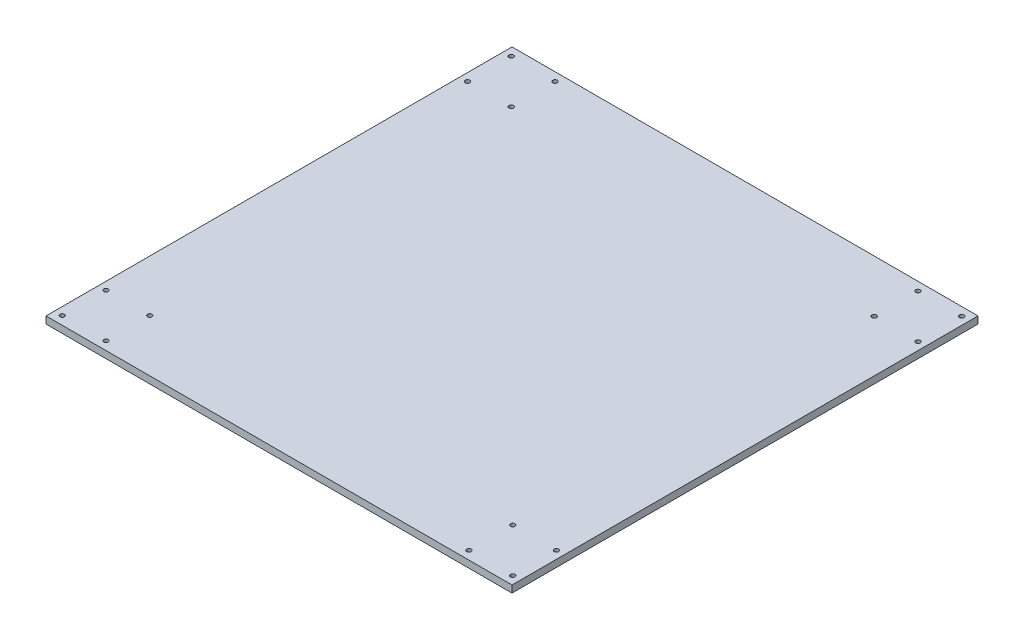
ISO-10303-21;
HEADER;
FILE_DESCRIPTION(('STEP AP214'),'2;1');
FILE_NAME('part.step','',(''),(''),'','','');
FILE_SCHEMA(('AUTOMOTIVE_DESIGN { 1 0 10303 214 1 1 1 1 }'));
ENDSEC;
DATA;
#1=APPLICATION_CONTEXT('core data for automotive mechanical design processes');
#2=APPLICATION_PROTOCOL_DEFINITION('international standard','automotive_design',2000,#1);
#3=PRODUCT_CONTEXT('',#1,'mechanical');
#4=PRODUCT('Part','Part','',(#3));
#5=PRODUCT_RELATED_PRODUCT_CATEGORY('part','',(#4));
#6=PRODUCT_DEFINITION_FORMATION('','',#4);
#7=PRODUCT_DEFINITION_CONTEXT('part definition',#1,'design');
#8=PRODUCT_DEFINITION('design','',#6,#7);
#9=PRODUCT_DEFINITION_SHAPE('','',#8);
#10=(LENGTH_UNIT() NAMED_UNIT(*) SI_UNIT(.MILLI.,.METRE.));
#11=(NAMED_UNIT(*) PLANE_ANGLE_UNIT() SI_UNIT($,.RADIAN.));
#12=(NAMED_UNIT(*) SI_UNIT($,.STERADIAN.) SOLID_ANGLE_UNIT());
#13=UNCERTAINTY_MEASURE_WITH_UNIT(LENGTH_MEASURE(1.E-05),#10,'distance_accuracy_value','');
#14=(GEOMETRIC_REPRESENTATION_CONTEXT(3) GLOBAL_UNCERTAINTY_ASSIGNED_CONTEXT((#13)) GLOBAL_UNIT_ASSIGNED_CONTEXT((#10,
#11,#12)) REPRESENTATION_CONTEXT('',''));
#15=CARTESIAN_POINT('',(0.,0.,0.));
#16=DIRECTION('',(0.,0.,1.));
#17=DIRECTION('',(1.,0.,0.));
#18=AXIS2_PLACEMENT_3D('',#15,#16,#17);
#19=CARTESIAN_POINT('',(-165.,5.,165.));
#20=DIRECTION('',(1.,0.,0.));
#21=DIRECTION('',(0.,0.,-1.));
#22=AXIS2_PLACEMENT_3D('',#19,#20,#21);
#23=PLANE('',#22);
#24=DIRECTION('',(0.,0.,1.));
#25=VECTOR('',#24,1.);
#26=CARTESIAN_POINT('',(-165.,0.,165.));
#27=LINE('',#26,#25);
#28=CARTESIAN_POINT('',(-165.,0.,-165.));
#29=VERTEX_POINT('',#28);
#30=CARTESIAN_POINT('',(-165.,0.,165.));
#31=VERTEX_POINT('',#30);
#32=EDGE_CURVE('E110',#29,#31,#27,.T.);
#33=ORIENTED_EDGE('',*,*,#32,.T.);
#34=DIRECTION('',(0.,-1.,0.));
#35=VECTOR('',#34,1.);
#36=CARTESIAN_POINT('',(-165.,5.,165.));
#37=LINE('',#36,#35);
#38=CARTESIAN_POINT('',(-165.,5.,165.));
#39=VERTEX_POINT('',#38);
#40=EDGE_CURVE('E11',#39,#31,#37,.T.);
#41=ORIENTED_EDGE('',*,*,#40,.F.);
#42=DIRECTION('',(0.,0.,1.));
#43=VECTOR('',#42,1.);
#44=CARTESIAN_POINT('',(-165.,5.,165.));
#45=LINE('',#44,#43);
#46=CARTESIAN_POINT('',(-165.,5.,-165.));
#47=VERTEX_POINT('',#46);
#48=EDGE_CURVE('E94',#47,#39,#45,.T.);
#49=ORIENTED_EDGE('',*,*,#48,.F.);
#50=DIRECTION('',(0.,-1.,0.));
#51=VECTOR('',#50,1.);
#52=CARTESIAN_POINT('',(-165.,5.,-165.));
#53=LINE('',#52,#51);
#54=EDGE_CURVE('E106',#47,#29,#53,.T.);
#55=ORIENTED_EDGE('',*,*,#54,.T.);
#56=EDGE_LOOP('',(#33,#41,#49,#55));
#57=FACE_BOUND('',#56,.T.);
#58=ADVANCED_FACE('F42',(#57),#23,.F.);
#59=CARTESIAN_POINT('',(165.,5.,165.));
#60=DIRECTION('',(0.,0.,-1.));
#61=DIRECTION('',(-1.,0.,0.));
#62=AXIS2_PLACEMENT_3D('',#59,#60,#61);
#63=PLANE('',#62);
#64=DIRECTION('',(1.,0.,0.));
#65=VECTOR('',#64,1.);
#66=CARTESIAN_POINT('',(165.,0.,165.));
#67=LINE('',#66,#65);
#68=CARTESIAN_POINT('',(165.,0.,165.));
#69=VERTEX_POINT('',#68);
#70=EDGE_CURVE('E99',#31,#69,#67,.T.);
#71=ORIENTED_EDGE('',*,*,#70,.T.);
#72=DIRECTION('',(0.,-1.,0.));
#73=VECTOR('',#72,1.);
#74=CARTESIAN_POINT('',(165.,5.,165.));
#75=LINE('',#74,#73);
#76=CARTESIAN_POINT('',(165.,5.,165.));
#77=VERTEX_POINT('',#76);
#78=EDGE_CURVE('E51',#77,#69,#75,.T.);
#79=ORIENTED_EDGE('',*,*,#78,.F.);
#80=DIRECTION('',(1.,0.,0.));
#81=VECTOR('',#80,1.);
#82=CARTESIAN_POINT('',(165.,5.,165.));
#83=LINE('',#82,#81);
#84=EDGE_CURVE('E89',#39,#77,#83,.T.);
#85=ORIENTED_EDGE('',*,*,#84,.F.);
#86=ORIENTED_EDGE('',*,*,#40,.T.);
#87=EDGE_LOOP('',(#71,#79,#85,#86));
#88=FACE_BOUND('',#87,.T.);
#89=ADVANCED_FACE('F98',(#88),#63,.F.);
#90=CARTESIAN_POINT('',(165.,5.,165.));
#91=DIRECTION('',(-1.,0.,0.));
#92=DIRECTION('',(0.,0.,1.));
#93=AXIS2_PLACEMENT_3D('',#90,#91,#92);
#94=PLANE('',#93);
#95=DIRECTION('',(0.,0.,-1.));
#96=VECTOR('',#95,1.);
#97=CARTESIAN_POINT('',(165.,0.,165.));
#98=LINE('',#97,#96);
#99=CARTESIAN_POINT('',(165.,0.,-165.));
#100=VERTEX_POINT('',#99);
#101=EDGE_CURVE('E76',#69,#100,#98,.T.);
#102=ORIENTED_EDGE('',*,*,#101,.T.);
#103=DIRECTION('',(0.,-1.,0.));
#104=VECTOR('',#103,1.);
#105=CARTESIAN_POINT('',(165.,5.,-165.));
#106=LINE('',#105,#104);
#107=CARTESIAN_POINT('',(165.,5.,-165.));
#108=VERTEX_POINT('',#107);
#109=EDGE_CURVE('E101',#108,#100,#106,.T.);
#110=ORIENTED_EDGE('',*,*,#109,.F.);
#111=DIRECTION('',(0.,0.,-1.));
#112=VECTOR('',#111,1.);
#113=CARTESIAN_POINT('',(165.,5.,165.));
#114=LINE('',#113,#112);
#115=EDGE_CURVE('E92',#77,#108,#114,.T.);
#116=ORIENTED_EDGE('',*,*,#115,.F.);
#117=ORIENTED_EDGE('',*,*,#78,.T.);
#118=EDGE_LOOP('',(#102,#110,#116,#117));
#119=FACE_BOUND('',#118,.T.);
#120=ADVANCED_FACE('F102',(#119),#94,.F.);
#121=CARTESIAN_POINT('',(165.,5.,-165.));
#122=DIRECTION('',(0.,0.,1.));
#123=DIRECTION('',(1.,0.,0.));
#124=AXIS2_PLACEMENT_3D('',#121,#122,#123);
#125=PLANE('',#124);
#126=DIRECTION('',(-1.,0.,0.));
#127=VECTOR('',#126,1.);
#128=CARTESIAN_POINT('',(165.,0.,-165.));
#129=LINE('',#128,#127);
#130=EDGE_CURVE('E82',#100,#29,#129,.T.);
#131=ORIENTED_EDGE('',*,*,#130,.T.);
#132=ORIENTED_EDGE('',*,*,#54,.F.);
#133=DIRECTION('',(-1.,0.,0.));
#134=VECTOR('',#133,1.);
#135=CARTESIAN_POINT('',(165.,5.,-165.));
#136=LINE('',#135,#134);
#137=EDGE_CURVE('E59',#108,#47,#136,.T.);
#138=ORIENTED_EDGE('',*,*,#137,.F.);
#139=ORIENTED_EDGE('',*,*,#109,.T.);
#140=EDGE_LOOP('',(#131,#132,#138,#139));
#141=FACE_BOUND('',#140,.T.);
#142=ADVANCED_FACE('F124',(#141),#125,.F.);
#143=CARTESIAN_POINT('',(0.,5.,0.));
#144=DIRECTION('',(0.,1.,0.));
#145=DIRECTION('',(0.,0.,1.));
#146=AXIS2_PLACEMENT_3D('',#143,#144,#145);
#147=PLANE('',#146);
#148=CARTESIAN_POINT('',(159.5,5.,-159.));
#149=DIRECTION('',(0.,1.,0.));
#150=DIRECTION('',(0.,0.,1.));
#151=AXIS2_PLACEMENT_3D('',#148,#149,#150);
#152=CIRCLE('',#151,1.60000000000002);
#153=CARTESIAN_POINT('',(159.5,5.,-157.4));
#154=VERTEX_POINT('',#153);
#155=EDGE_CURVE('E160',#154,#154,#152,.T.);
#156=ORIENTED_EDGE('',*,*,#155,.F.);
#157=EDGE_LOOP('',(#156));
#158=FACE_BOUND('',#157,.T.);
#159=CARTESIAN_POINT('',(128.5,5.,-128.));
#160=DIRECTION('',(0.,1.,0.));
#161=DIRECTION('',(0.,0.,1.));
#162=AXIS2_PLACEMENT_3D('',#159,#160,#161);
#163=CIRCLE('',#162,1.59999999999999);
#164=CARTESIAN_POINT('',(128.5,5.,-126.4));
#165=VERTEX_POINT('',#164);
#166=EDGE_CURVE('E175',#165,#165,#163,.T.);
#167=ORIENTED_EDGE('',*,*,#166,.F.);
#168=EDGE_LOOP('',(#167));
#169=FACE_BOUND('',#168,.T.);
#170=CARTESIAN_POINT('',(159.5,5.,-128.));
#171=DIRECTION('',(0.,1.,0.));
#172=DIRECTION('',(0.,0.,1.));
#173=AXIS2_PLACEMENT_3D('',#170,#171,#172);
#174=CIRCLE('',#173,1.60000000000002);
#175=CARTESIAN_POINT('',(159.5,5.,-126.4));
#176=VERTEX_POINT('',#175);
#177=EDGE_CURVE('E176',#176,#176,#174,.T.);
#178=ORIENTED_EDGE('',*,*,#177,.F.);
#179=EDGE_LOOP('',(#178));
#180=FACE_BOUND('',#179,.T.);
#181=CARTESIAN_POINT('',(128.5,5.,128.));
#182=DIRECTION('',(0.,1.,0.));
#183=DIRECTION('',(0.,0.,1.));
#184=AXIS2_PLACEMENT_3D('',#181,#182,#183);
#185=CIRCLE('',#184,1.59999999999999);
#186=CARTESIAN_POINT('',(128.5,5.,129.6));
#187=VERTEX_POINT('',#186);
#188=EDGE_CURVE('E191',#187,#187,#185,.T.);
#189=ORIENTED_EDGE('',*,*,#188,.F.);
#190=EDGE_LOOP('',(#189));
#191=FACE_BOUND('',#190,.T.);
#192=CARTESIAN_POINT('',(-128.5,5.,-159.));
#193=DIRECTION('',(0.,1.,0.));
#194=DIRECTION('',(0.,0.,1.));
#195=AXIS2_PLACEMENT_3D('',#192,#193,#194);
#196=CIRCLE('',#195,1.59999999999999);
#197=CARTESIAN_POINT('',(-128.5,5.,-157.4));
#198=VERTEX_POINT('',#197);
#199=EDGE_CURVE('E135',#198,#198,#196,.T.);
#200=ORIENTED_EDGE('',*,*,#199,.F.);
#201=EDGE_LOOP('',(#200));
#202=FACE_BOUND('',#201,.T.);
#203=CARTESIAN_POINT('',(-159.5,5.,-128.));
#204=DIRECTION('',(0.,1.,0.));
#205=DIRECTION('',(0.,0.,1.));
#206=AXIS2_PLACEMENT_3D('',#203,#204,#205);
#207=CIRCLE('',#206,1.60220376312059);
#208=CARTESIAN_POINT('',(-159.5,5.,-126.397796236879));
#209=VERTEX_POINT('',#208);
#210=EDGE_CURVE('E143',#209,#209,#207,.T.);
#211=ORIENTED_EDGE('',*,*,#210,.F.);
#212=EDGE_LOOP('',(#211));
#213=FACE_BOUND('',#212,.T.);
#214=CARTESIAN_POINT('',(-128.5,5.,-128.));
#215=DIRECTION('',(0.,1.,0.));
#216=DIRECTION('',(0.,0.,1.));
#217=AXIS2_PLACEMENT_3D('',#214,#215,#216);
#218=CIRCLE('',#217,1.59999999999999);
#219=CARTESIAN_POINT('',(-128.5,5.,-126.4));
#220=VERTEX_POINT('',#219);
#221=EDGE_CURVE('E144',#220,#220,#218,.T.);
#222=ORIENTED_EDGE('',*,*,#221,.F.);
#223=EDGE_LOOP('',(#222));
#224=FACE_BOUND('',#223,.T.);
#225=CARTESIAN_POINT('',(128.5,5.,-159.));
#226=DIRECTION('',(0.,1.,0.));
#227=DIRECTION('',(0.,0.,1.));
#228=AXIS2_PLACEMENT_3D('',#225,#226,#227);
#229=CIRCLE('',#228,1.59999999999999);
#230=CARTESIAN_POINT('',(128.5,5.,-157.4));
#231=VERTEX_POINT('',#230);
#232=EDGE_CURVE('E159',#231,#231,#229,.T.);
#233=ORIENTED_EDGE('',*,*,#232,.F.);
#234=EDGE_LOOP('',(#233));
#235=FACE_BOUND('',#234,.T.);
#236=CARTESIAN_POINT('',(-128.5,5.,128.));
#237=DIRECTION('',(0.,1.,0.));
#238=DIRECTION('',(0.,0.,1.));
#239=AXIS2_PLACEMENT_3D('',#236,#237,#238);
#240=CIRCLE('',#239,1.60000000000005);
#241=CARTESIAN_POINT('',(-128.5,5.,129.6));
#242=VERTEX_POINT('',#241);
#243=EDGE_CURVE('E239',#242,#242,#240,.T.);
#244=ORIENTED_EDGE('',*,*,#243,.F.);
#245=EDGE_LOOP('',(#244));
#246=FACE_BOUND('',#245,.T.);
#247=CARTESIAN_POINT('',(-159.5,5.,128.));
#248=DIRECTION('',(0.,1.,0.));
#249=DIRECTION('',(0.,0.,1.));
#250=AXIS2_PLACEMENT_3D('',#247,#248,#249);
#251=CIRCLE('',#250,1.59999999999999);
#252=CARTESIAN_POINT('',(-159.5,5.,129.6));
#253=VERTEX_POINT('',#252);
#254=EDGE_CURVE('E247',#253,#253,#251,.T.);
#255=ORIENTED_EDGE('',*,*,#254,.F.);
#256=EDGE_LOOP('',(#255));
#257=FACE_BOUND('',#256,.T.);
#258=CARTESIAN_POINT('',(-159.5,5.,159.));
#259=DIRECTION('',(0.,1.,0.));
#260=DIRECTION('',(0.,0.,1.));
#261=AXIS2_PLACEMENT_3D('',#258,#259,#260);
#262=CIRCLE('',#261,1.59999999999999);
#263=CARTESIAN_POINT('',(-159.5,5.,160.6));
#264=VERTEX_POINT('',#263);
#265=EDGE_CURVE('E208',#264,#264,#262,.T.);
#266=ORIENTED_EDGE('',*,*,#265,.F.);
#267=EDGE_LOOP('',(#266));
#268=FACE_BOUND('',#267,.T.);
#269=CARTESIAN_POINT('',(-128.5,5.,159.));
#270=DIRECTION('',(0.,1.,0.));
#271=DIRECTION('',(0.,0.,1.));
#272=AXIS2_PLACEMENT_3D('',#269,#270,#271);
#273=CIRCLE('',#272,1.60000000000002);
#274=CARTESIAN_POINT('',(-128.5,5.,160.6));
#275=VERTEX_POINT('',#274);
#276=EDGE_CURVE('E207',#275,#275,#273,.T.);
#277=ORIENTED_EDGE('',*,*,#276,.F.);
#278=EDGE_LOOP('',(#277));
#279=FACE_BOUND('',#278,.T.);
#280=CARTESIAN_POINT('',(128.5,5.,159.));
#281=DIRECTION('',(0.,1.,0.));
#282=DIRECTION('',(0.,0.,1.));
#283=AXIS2_PLACEMENT_3D('',#280,#281,#282);
#284=CIRCLE('',#283,1.59999999999999);
#285=CARTESIAN_POINT('',(128.5,5.,160.6));
#286=VERTEX_POINT('',#285);
#287=EDGE_CURVE('E216',#286,#286,#284,.T.);
#288=ORIENTED_EDGE('',*,*,#287,.F.);
#289=EDGE_LOOP('',(#288));
#290=FACE_BOUND('',#289,.T.);
#291=CARTESIAN_POINT('',(159.5,5.,159.));
#292=DIRECTION('',(0.,1.,0.));
#293=DIRECTION('',(0.,0.,1.));
#294=AXIS2_PLACEMENT_3D('',#291,#292,#293);
#295=CIRCLE('',#294,1.60000000000002);
#296=CARTESIAN_POINT('',(159.5,5.,160.6));
#297=VERTEX_POINT('',#296);
#298=EDGE_CURVE('E224',#297,#297,#295,.T.);
#299=ORIENTED_EDGE('',*,*,#298,.F.);
#300=EDGE_LOOP('',(#299));
#301=FACE_BOUND('',#300,.T.);
#302=CARTESIAN_POINT('',(159.5,5.,128.));
#303=DIRECTION('',(0.,1.,0.));
#304=DIRECTION('',(0.,0.,1.));
#305=AXIS2_PLACEMENT_3D('',#302,#303,#304);
#306=CIRCLE('',#305,1.60000000000002);
#307=CARTESIAN_POINT('',(159.5,5.,129.6));
#308=VERTEX_POINT('',#307);
#309=EDGE_CURVE('E192',#308,#308,#306,.T.);
#310=ORIENTED_EDGE('',*,*,#309,.F.);
#311=EDGE_LOOP('',(#310));
#312=FACE_BOUND('',#311,.T.);
#313=CARTESIAN_POINT('',(-159.5,5.,-159.));
#314=DIRECTION('',(0.,1.,0.));
#315=DIRECTION('',(0.,0.,1.));
#316=AXIS2_PLACEMENT_3D('',#313,#314,#315);
#317=CIRCLE('',#316,1.60000000000002);
#318=CARTESIAN_POINT('',(-159.5,5.,-157.4));
#319=VERTEX_POINT('',#318);
#320=EDGE_CURVE('E131',#319,#319,#317,.T.);
#321=ORIENTED_EDGE('',*,*,#320,.F.);
#322=EDGE_LOOP('',(#321));
#323=FACE_BOUND('',#322,.T.);
#324=ORIENTED_EDGE('',*,*,#48,.T.);
#325=ORIENTED_EDGE('',*,*,#84,.T.);
#326=ORIENTED_EDGE('',*,*,#115,.T.);
#327=ORIENTED_EDGE('',*,*,#137,.T.);
#328=EDGE_LOOP('',(#324,#325,#326,#327));
#329=FACE_BOUND('',#328,.T.);
#330=ADVANCED_FACE('F90',(#158,#169,#180,#191,#202,#213,#224,#235,#246,#257,#268,#279,#290,#301,
#312,#323,#329),#147,.T.);
#331=CARTESIAN_POINT('',(0.,0.,0.));
#332=DIRECTION('',(0.,1.,0.));
#333=DIRECTION('',(0.,0.,1.));
#334=AXIS2_PLACEMENT_3D('',#331,#332,#333);
#335=PLANE('',#334);
#336=CARTESIAN_POINT('',(159.5,0.,-159.));
#337=DIRECTION('',(0.,1.,0.));
#338=DIRECTION('',(0.,0.,1.));
#339=AXIS2_PLACEMENT_3D('',#336,#337,#338);
#340=CIRCLE('',#339,1.60000000000002);
#341=CARTESIAN_POINT('',(159.5,0.,-157.4));
#342=VERTEX_POINT('',#341);
#343=EDGE_CURVE('E180',#342,#342,#340,.T.);
#344=ORIENTED_EDGE('',*,*,#343,.T.);
#345=EDGE_LOOP('',(#344));
#346=FACE_BOUND('',#345,.T.);
#347=CARTESIAN_POINT('',(128.5,0.,-128.));
#348=DIRECTION('',(0.,1.,0.));
#349=DIRECTION('',(0.,0.,1.));
#350=AXIS2_PLACEMENT_3D('',#347,#348,#349);
#351=CIRCLE('',#350,1.59999999999999);
#352=CARTESIAN_POINT('',(128.5,0.,-126.4));
#353=VERTEX_POINT('',#352);
#354=EDGE_CURVE('E171',#353,#353,#351,.T.);
#355=ORIENTED_EDGE('',*,*,#354,.T.);
#356=EDGE_LOOP('',(#355));
#357=FACE_BOUND('',#356,.T.);
#358=CARTESIAN_POINT('',(159.5,0.,-128.));
#359=DIRECTION('',(0.,1.,0.));
#360=DIRECTION('',(0.,0.,1.));
#361=AXIS2_PLACEMENT_3D('',#358,#359,#360);
#362=CIRCLE('',#361,1.60000000000002);
#363=CARTESIAN_POINT('',(159.5,0.,-126.4));
#364=VERTEX_POINT('',#363);
#365=EDGE_CURVE('E196',#364,#364,#362,.T.);
#366=ORIENTED_EDGE('',*,*,#365,.T.);
#367=EDGE_LOOP('',(#366));
#368=FACE_BOUND('',#367,.T.);
#369=CARTESIAN_POINT('',(128.5,0.,128.));
#370=DIRECTION('',(0.,1.,0.));
#371=DIRECTION('',(0.,0.,1.));
#372=AXIS2_PLACEMENT_3D('',#369,#370,#371);
#373=CIRCLE('',#372,1.59999999999999);
#374=CARTESIAN_POINT('',(128.5,0.,129.6));
#375=VERTEX_POINT('',#374);
#376=EDGE_CURVE('E187',#375,#375,#373,.T.);
#377=ORIENTED_EDGE('',*,*,#376,.T.);
#378=EDGE_LOOP('',(#377));
#379=FACE_BOUND('',#378,.T.);
#380=CARTESIAN_POINT('',(-128.5,0.,-159.));
#381=DIRECTION('',(0.,1.,0.));
#382=DIRECTION('',(0.,0.,1.));
#383=AXIS2_PLACEMENT_3D('',#380,#381,#382);
#384=CIRCLE('',#383,1.59999999999999);
#385=CARTESIAN_POINT('',(-128.5,0.,-157.4));
#386=VERTEX_POINT('',#385);
#387=EDGE_CURVE('E148',#386,#386,#384,.T.);
#388=ORIENTED_EDGE('',*,*,#387,.T.);
#389=EDGE_LOOP('',(#388));
#390=FACE_BOUND('',#389,.T.);
#391=CARTESIAN_POINT('',(-159.5,0.,-128.));
#392=DIRECTION('',(0.,1.,0.));
#393=DIRECTION('',(0.,0.,1.));
#394=AXIS2_PLACEMENT_3D('',#391,#392,#393);
#395=CIRCLE('',#394,1.60220376312059);
#396=CARTESIAN_POINT('',(-159.5,0.,-126.397796236879));
#397=VERTEX_POINT('',#396);
#398=EDGE_CURVE('E139',#397,#397,#395,.T.);
#399=ORIENTED_EDGE('',*,*,#398,.T.);
#400=EDGE_LOOP('',(#399));
#401=FACE_BOUND('',#400,.T.);
#402=CARTESIAN_POINT('',(-128.5,0.,-128.));
#403=DIRECTION('',(0.,1.,0.));
#404=DIRECTION('',(0.,0.,1.));
#405=AXIS2_PLACEMENT_3D('',#402,#403,#404);
#406=CIRCLE('',#405,1.59999999999999);
#407=CARTESIAN_POINT('',(-128.5,0.,-126.4));
#408=VERTEX_POINT('',#407);
#409=EDGE_CURVE('E164',#408,#408,#406,.T.);
#410=ORIENTED_EDGE('',*,*,#409,.T.);
#411=EDGE_LOOP('',(#410));
#412=FACE_BOUND('',#411,.T.);
#413=CARTESIAN_POINT('',(128.5,0.,-159.));
#414=DIRECTION('',(0.,1.,0.));
#415=DIRECTION('',(0.,0.,1.));
#416=AXIS2_PLACEMENT_3D('',#413,#414,#415);
#417=CIRCLE('',#416,1.59999999999999);
#418=CARTESIAN_POINT('',(128.5,0.,-157.4));
#419=VERTEX_POINT('',#418);
#420=EDGE_CURVE('E155',#419,#419,#417,.T.);
#421=ORIENTED_EDGE('',*,*,#420,.T.);
#422=EDGE_LOOP('',(#421));
#423=FACE_BOUND('',#422,.T.);
#424=CARTESIAN_POINT('',(-128.5,0.,128.));
#425=DIRECTION('',(0.,1.,0.));
#426=DIRECTION('',(0.,0.,1.));
#427=AXIS2_PLACEMENT_3D('',#424,#425,#426);
#428=CIRCLE('',#427,1.60000000000005);
#429=CARTESIAN_POINT('',(-128.5,0.,129.6));
#430=VERTEX_POINT('',#429);
#431=EDGE_CURVE('E235',#430,#430,#428,.T.);
#432=ORIENTED_EDGE('',*,*,#431,.T.);
#433=EDGE_LOOP('',(#432));
#434=FACE_BOUND('',#433,.T.);
#435=CARTESIAN_POINT('',(-159.5,0.,128.));
#436=DIRECTION('',(0.,1.,0.));
#437=DIRECTION('',(0.,0.,1.));
#438=AXIS2_PLACEMENT_3D('',#435,#436,#437);
#439=CIRCLE('',#438,1.59999999999999);
#440=CARTESIAN_POINT('',(-159.5,0.,129.6));
#441=VERTEX_POINT('',#440);
#442=EDGE_CURVE('E243',#441,#441,#439,.T.);
#443=ORIENTED_EDGE('',*,*,#442,.T.);
#444=EDGE_LOOP('',(#443));
#445=FACE_BOUND('',#444,.T.);
#446=CARTESIAN_POINT('',(-159.5,0.,159.));
#447=DIRECTION('',(0.,1.,0.));
#448=DIRECTION('',(0.,0.,1.));
#449=AXIS2_PLACEMENT_3D('',#446,#447,#448);
#450=CIRCLE('',#449,1.59999999999999);
#451=CARTESIAN_POINT('',(-159.5,0.,160.6));
#452=VERTEX_POINT('',#451);
#453=EDGE_CURVE('E251',#452,#452,#450,.T.);
#454=ORIENTED_EDGE('',*,*,#453,.T.);
#455=EDGE_LOOP('',(#454));
#456=FACE_BOUND('',#455,.T.);
#457=CARTESIAN_POINT('',(-128.5,0.,159.));
#458=DIRECTION('',(0.,1.,0.));
#459=DIRECTION('',(0.,0.,1.));
#460=AXIS2_PLACEMENT_3D('',#457,#458,#459);
#461=CIRCLE('',#460,1.60000000000002);
#462=CARTESIAN_POINT('',(-128.5,0.,160.6));
#463=VERTEX_POINT('',#462);
#464=EDGE_CURVE('E203',#463,#463,#461,.T.);
#465=ORIENTED_EDGE('',*,*,#464,.T.);
#466=EDGE_LOOP('',(#465));
#467=FACE_BOUND('',#466,.T.);
#468=CARTESIAN_POINT('',(128.5,0.,159.));
#469=DIRECTION('',(0.,1.,0.));
#470=DIRECTION('',(0.,0.,1.));
#471=AXIS2_PLACEMENT_3D('',#468,#469,#470);
#472=CIRCLE('',#471,1.59999999999999);
#473=CARTESIAN_POINT('',(128.5,0.,160.6));
#474=VERTEX_POINT('',#473);
#475=EDGE_CURVE('E212',#474,#474,#472,.T.);
#476=ORIENTED_EDGE('',*,*,#475,.T.);
#477=EDGE_LOOP('',(#476));
#478=FACE_BOUND('',#477,.T.);
#479=CARTESIAN_POINT('',(159.5,0.,159.));
#480=DIRECTION('',(0.,1.,0.));
#481=DIRECTION('',(0.,0.,1.));
#482=AXIS2_PLACEMENT_3D('',#479,#480,#481);
#483=CIRCLE('',#482,1.60000000000002);
#484=CARTESIAN_POINT('',(159.5,0.,160.6));
#485=VERTEX_POINT('',#484);
#486=EDGE_CURVE('E220',#485,#485,#483,.T.);
#487=ORIENTED_EDGE('',*,*,#486,.T.);
#488=EDGE_LOOP('',(#487));
#489=FACE_BOUND('',#488,.T.);
#490=CARTESIAN_POINT('',(159.5,0.,128.));
#491=DIRECTION('',(0.,1.,0.));
#492=DIRECTION('',(0.,0.,1.));
#493=AXIS2_PLACEMENT_3D('',#490,#491,#492);
#494=CIRCLE('',#493,1.60000000000002);
#495=CARTESIAN_POINT('',(159.5,0.,129.6));
#496=VERTEX_POINT('',#495);
#497=EDGE_CURVE('E228',#496,#496,#494,.T.);
#498=ORIENTED_EDGE('',*,*,#497,.T.);
#499=EDGE_LOOP('',(#498));
#500=FACE_BOUND('',#499,.T.);
#501=CARTESIAN_POINT('',(-159.5,0.,-159.));
#502=DIRECTION('',(0.,1.,0.));
#503=DIRECTION('',(0.,0.,1.));
#504=AXIS2_PLACEMENT_3D('',#501,#502,#503);
#505=CIRCLE('',#504,1.60000000000002);
#506=CARTESIAN_POINT('',(-159.5,0.,-157.4));
#507=VERTEX_POINT('',#506);
#508=EDGE_CURVE('E114',#507,#507,#505,.T.);
#509=ORIENTED_EDGE('',*,*,#508,.T.);
#510=EDGE_LOOP('',(#509));
#511=FACE_BOUND('',#510,.T.);
#512=ORIENTED_EDGE('',*,*,#32,.F.);
#513=ORIENTED_EDGE('',*,*,#130,.F.);
#514=ORIENTED_EDGE('',*,*,#101,.F.);
#515=ORIENTED_EDGE('',*,*,#70,.F.);
#516=EDGE_LOOP('',(#512,#513,#514,#515));
#517=FACE_BOUND('',#516,.T.);
#518=ADVANCED_FACE('F127',(#346,#357,#368,#379,#390,#401,#412,#423,#434,#445,#456,#467,#478,
#489,#500,#511,#517),#335,.F.);
#519=CARTESIAN_POINT('',(-159.5,0.,-159.));
#520=DIRECTION('',(0.,1.,0.));
#521=DIRECTION('',(0.,0.,1.));
#522=AXIS2_PLACEMENT_3D('',#519,#520,#521);
#523=CYLINDRICAL_SURFACE('',#522,1.60000000000002);
#524=ORIENTED_EDGE('',*,*,#508,.F.);
#525=EDGE_LOOP('',(#524));
#526=FACE_BOUND('',#525,.T.);
#527=ORIENTED_EDGE('',*,*,#320,.T.);
#528=EDGE_LOOP('',(#527));
#529=FACE_BOUND('',#528,.T.);
#530=ADVANCED_FACE('F275',(#526,#529),#523,.F.);
#531=CARTESIAN_POINT('',(159.5,0.,128.));
#532=DIRECTION('',(0.,1.,0.));
#533=DIRECTION('',(0.,0.,1.));
#534=AXIS2_PLACEMENT_3D('',#531,#532,#533);
#535=CYLINDRICAL_SURFACE('',#534,1.60000000000002);
#536=ORIENTED_EDGE('',*,*,#497,.F.);
#537=EDGE_LOOP('',(#536));
#538=FACE_BOUND('',#537,.T.);
#539=ORIENTED_EDGE('',*,*,#309,.T.);
#540=EDGE_LOOP('',(#539));
#541=FACE_BOUND('',#540,.T.);
#542=ADVANCED_FACE('F277',(#538,#541),#535,.F.);
#543=CARTESIAN_POINT('',(159.5,0.,159.));
#544=DIRECTION('',(0.,1.,0.));
#545=DIRECTION('',(0.,0.,1.));
#546=AXIS2_PLACEMENT_3D('',#543,#544,#545);
#547=CYLINDRICAL_SURFACE('',#546,1.60000000000002);
#548=ORIENTED_EDGE('',*,*,#486,.F.);
#549=EDGE_LOOP('',(#548));
#550=FACE_BOUND('',#549,.T.);
#551=ORIENTED_EDGE('',*,*,#298,.T.);
#552=EDGE_LOOP('',(#551));
#553=FACE_BOUND('',#552,.T.);
#554=ADVANCED_FACE('F284',(#550,#553),#547,.F.);
#555=CARTESIAN_POINT('',(128.5,0.,159.));
#556=DIRECTION('',(0.,1.,0.));
#557=DIRECTION('',(0.,0.,1.));
#558=AXIS2_PLACEMENT_3D('',#555,#556,#557);
#559=CYLINDRICAL_SURFACE('',#558,1.59999999999999);
#560=ORIENTED_EDGE('',*,*,#475,.F.);
#561=EDGE_LOOP('',(#560));
#562=FACE_BOUND('',#561,.T.);
#563=ORIENTED_EDGE('',*,*,#287,.T.);
#564=EDGE_LOOP('',(#563));
#565=FACE_BOUND('',#564,.T.);
#566=ADVANCED_FACE('F335',(#562,#565),#559,.F.);
#567=CARTESIAN_POINT('',(-128.5,0.,159.));
#568=DIRECTION('',(0.,1.,0.));
#569=DIRECTION('',(0.,0.,1.));
#570=AXIS2_PLACEMENT_3D('',#567,#568,#569);
#571=CYLINDRICAL_SURFACE('',#570,1.60000000000002);
#572=ORIENTED_EDGE('',*,*,#464,.F.);
#573=EDGE_LOOP('',(#572));
#574=FACE_BOUND('',#573,.T.);
#575=ORIENTED_EDGE('',*,*,#276,.T.);
#576=EDGE_LOOP('',(#575));
#577=FACE_BOUND('',#576,.T.);
#578=ADVANCED_FACE('F346',(#574,#577),#571,.F.);
#579=CARTESIAN_POINT('',(-159.5,0.,159.));
#580=DIRECTION('',(0.,1.,0.));
#581=DIRECTION('',(0.,0.,1.));
#582=AXIS2_PLACEMENT_3D('',#579,#580,#581);
#583=CYLINDRICAL_SURFACE('',#582,1.59999999999999);
#584=ORIENTED_EDGE('',*,*,#453,.F.);
#585=EDGE_LOOP('',(#584));
#586=FACE_BOUND('',#585,.T.);
#587=ORIENTED_EDGE('',*,*,#265,.T.);
#588=EDGE_LOOP('',(#587));
#589=FACE_BOUND('',#588,.T.);
#590=ADVANCED_FACE('F259',(#586,#589),#583,.F.);
#591=CARTESIAN_POINT('',(-159.5,0.,128.));
#592=DIRECTION('',(0.,1.,0.));
#593=DIRECTION('',(0.,0.,1.));
#594=AXIS2_PLACEMENT_3D('',#591,#592,#593);
#595=CYLINDRICAL_SURFACE('',#594,1.59999999999999);
#596=ORIENTED_EDGE('',*,*,#442,.F.);
#597=EDGE_LOOP('',(#596));
#598=FACE_BOUND('',#597,.T.);
#599=ORIENTED_EDGE('',*,*,#254,.T.);
#600=EDGE_LOOP('',(#599));
#601=FACE_BOUND('',#600,.T.);
#602=ADVANCED_FACE('F367',(#598,#601),#595,.F.);
#603=CARTESIAN_POINT('',(-128.5,0.,128.));
#604=DIRECTION('',(0.,1.,0.));
#605=DIRECTION('',(0.,0.,1.));
#606=AXIS2_PLACEMENT_3D('',#603,#604,#605);
#607=CYLINDRICAL_SURFACE('',#606,1.60000000000005);
#608=ORIENTED_EDGE('',*,*,#431,.F.);
#609=EDGE_LOOP('',(#608));
#610=FACE_BOUND('',#609,.T.);
#611=ORIENTED_EDGE('',*,*,#243,.T.);
#612=EDGE_LOOP('',(#611));
#613=FACE_BOUND('',#612,.T.);
#614=ADVANCED_FACE('F378',(#610,#613),#607,.F.);
#615=CARTESIAN_POINT('',(128.5,0.,-159.));
#616=DIRECTION('',(0.,1.,0.));
#617=DIRECTION('',(0.,0.,1.));
#618=AXIS2_PLACEMENT_3D('',#615,#616,#617);
#619=CYLINDRICAL_SURFACE('',#618,1.59999999999999);
#620=ORIENTED_EDGE('',*,*,#420,.F.);
#621=EDGE_LOOP('',(#620));
#622=FACE_BOUND('',#621,.T.);
#623=ORIENTED_EDGE('',*,*,#232,.T.);
#624=EDGE_LOOP('',(#623));
#625=FACE_BOUND('',#624,.T.);
#626=ADVANCED_FACE('F389',(#622,#625),#619,.F.);
#627=CARTESIAN_POINT('',(-128.5,0.,-128.));
#628=DIRECTION('',(0.,1.,0.));
#629=DIRECTION('',(0.,0.,1.));
#630=AXIS2_PLACEMENT_3D('',#627,#628,#629);
#631=CYLINDRICAL_SURFACE('',#630,1.59999999999999);
#632=ORIENTED_EDGE('',*,*,#409,.F.);
#633=EDGE_LOOP('',(#632));
#634=FACE_BOUND('',#633,.T.);
#635=ORIENTED_EDGE('',*,*,#221,.T.);
#636=EDGE_LOOP('',(#635));
#637=FACE_BOUND('',#636,.T.);
#638=ADVANCED_FACE('F400',(#634,#637),#631,.F.);
#639=CARTESIAN_POINT('',(-159.5,0.,-128.));
#640=DIRECTION('',(0.,1.,0.));
#641=DIRECTION('',(0.,0.,1.));
#642=AXIS2_PLACEMENT_3D('',#639,#640,#641);
#643=CYLINDRICAL_SURFACE('',#642,1.60220376312059);
#644=ORIENTED_EDGE('',*,*,#398,.F.);
#645=EDGE_LOOP('',(#644));
#646=FACE_BOUND('',#645,.T.);
#647=ORIENTED_EDGE('',*,*,#210,.T.);
#648=EDGE_LOOP('',(#647));
#649=FACE_BOUND('',#648,.T.);
#650=ADVANCED_FACE('F411',(#646,#649),#643,.F.);
#651=CARTESIAN_POINT('',(-128.5,0.,-159.));
#652=DIRECTION('',(0.,1.,0.));
#653=DIRECTION('',(0.,0.,1.));
#654=AXIS2_PLACEMENT_3D('',#651,#652,#653);
#655=CYLINDRICAL_SURFACE('',#654,1.59999999999999);
#656=ORIENTED_EDGE('',*,*,#387,.F.);
#657=EDGE_LOOP('',(#656));
#658=FACE_BOUND('',#657,.T.);
#659=ORIENTED_EDGE('',*,*,#199,.T.);
#660=EDGE_LOOP('',(#659));
#661=FACE_BOUND('',#660,.T.);
#662=ADVANCED_FACE('F422',(#658,#661),#655,.F.);
#663=CARTESIAN_POINT('',(128.5,0.,128.));
#664=DIRECTION('',(0.,1.,0.));
#665=DIRECTION('',(0.,0.,1.));
#666=AXIS2_PLACEMENT_3D('',#663,#664,#665);
#667=CYLINDRICAL_SURFACE('',#666,1.59999999999999);
#668=ORIENTED_EDGE('',*,*,#376,.F.);
#669=EDGE_LOOP('',(#668));
#670=FACE_BOUND('',#669,.T.);
#671=ORIENTED_EDGE('',*,*,#188,.T.);
#672=EDGE_LOOP('',(#671));
#673=FACE_BOUND('',#672,.T.);
#674=ADVANCED_FACE('F432',(#670,#673),#667,.F.);
#675=CARTESIAN_POINT('',(159.5,0.,-128.));
#676=DIRECTION('',(0.,1.,0.));
#677=DIRECTION('',(0.,0.,1.));
#678=AXIS2_PLACEMENT_3D('',#675,#676,#677);
#679=CYLINDRICAL_SURFACE('',#678,1.60000000000002);
#680=ORIENTED_EDGE('',*,*,#365,.F.);
#681=EDGE_LOOP('',(#680));
#682=FACE_BOUND('',#681,.T.);
#683=ORIENTED_EDGE('',*,*,#177,.T.);
#684=EDGE_LOOP('',(#683));
#685=FACE_BOUND('',#684,.T.);
#686=ADVANCED_FACE('F443',(#682,#685),#679,.F.);
#687=CARTESIAN_POINT('',(128.5,0.,-128.));
#688=DIRECTION('',(0.,1.,0.));
#689=DIRECTION('',(0.,0.,1.));
#690=AXIS2_PLACEMENT_3D('',#687,#688,#689);
#691=CYLINDRICAL_SURFACE('',#690,1.59999999999999);
#692=ORIENTED_EDGE('',*,*,#354,.F.);
#693=EDGE_LOOP('',(#692));
#694=FACE_BOUND('',#693,.T.);
#695=ORIENTED_EDGE('',*,*,#166,.T.);
#696=EDGE_LOOP('',(#695));
#697=FACE_BOUND('',#696,.T.);
#698=ADVANCED_FACE('F454',(#694,#697),#691,.F.);
#699=CARTESIAN_POINT('',(159.5,0.,-159.));
#700=DIRECTION('',(0.,1.,0.));
#701=DIRECTION('',(0.,0.,1.));
#702=AXIS2_PLACEMENT_3D('',#699,#700,#701);
#703=CYLINDRICAL_SURFACE('',#702,1.60000000000002);
#704=ORIENTED_EDGE('',*,*,#343,.F.);
#705=EDGE_LOOP('',(#704));
#706=FACE_BOUND('',#705,.T.);
#707=ORIENTED_EDGE('',*,*,#155,.T.);
#708=EDGE_LOOP('',(#707));
#709=FACE_BOUND('',#708,.T.);
#710=ADVANCED_FACE('F465',(#706,#709),#703,.F.);
#711=CLOSED_SHELL('',(#58,#89,#120,#142,#330,#518,#530,#542,#554,#566,#578,#590,#602,#614,#626,
#638,#650,#662,#674,#686,#698,#710));
#712=MANIFOLD_SOLID_BREP('B2',#711);
#713=ADVANCED_BREP_SHAPE_REPRESENTATION('',(#18,#712),#14);
#714=SHAPE_DEFINITION_REPRESENTATION(#9,#713);
ENDSEC;
END-ISO-10303-21;
